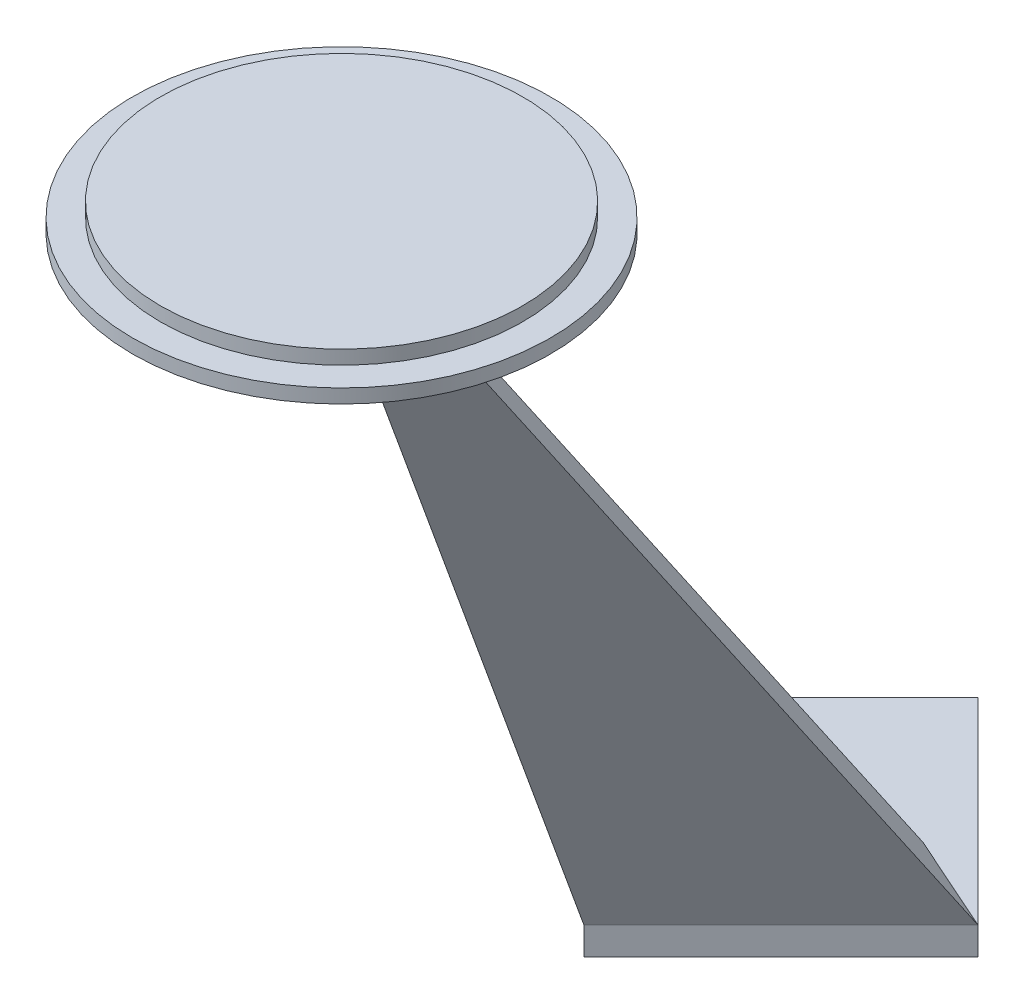
ISO-10303-21;
HEADER;
FILE_DESCRIPTION(('STEP AP214'),'2;1');
FILE_NAME('part.step','',(''),(''),'','','');
FILE_SCHEMA(('AUTOMOTIVE_DESIGN { 1 0 10303 214 1 1 1 1 }'));
ENDSEC;
DATA;
#1=APPLICATION_CONTEXT('core data for automotive mechanical design processes');
#2=APPLICATION_PROTOCOL_DEFINITION('international standard','automotive_design',2000,#1);
#3=PRODUCT_CONTEXT('',#1,'mechanical');
#4=PRODUCT('Part','Part','',(#3));
#5=PRODUCT_RELATED_PRODUCT_CATEGORY('part','',(#4));
#6=PRODUCT_DEFINITION_FORMATION('','',#4);
#7=PRODUCT_DEFINITION_CONTEXT('part definition',#1,'design');
#8=PRODUCT_DEFINITION('design','',#6,#7);
#9=PRODUCT_DEFINITION_SHAPE('','',#8);
#10=(LENGTH_UNIT() NAMED_UNIT(*) SI_UNIT(.MILLI.,.METRE.));
#11=(NAMED_UNIT(*) PLANE_ANGLE_UNIT() SI_UNIT($,.RADIAN.));
#12=(NAMED_UNIT(*) SI_UNIT($,.STERADIAN.) SOLID_ANGLE_UNIT());
#13=UNCERTAINTY_MEASURE_WITH_UNIT(LENGTH_MEASURE(1.E-05),#10,'distance_accuracy_value','');
#14=(GEOMETRIC_REPRESENTATION_CONTEXT(3) GLOBAL_UNCERTAINTY_ASSIGNED_CONTEXT((#13)) GLOBAL_UNIT_ASSIGNED_CONTEXT((#10,
#11,#12)) REPRESENTATION_CONTEXT('',''));
#15=CARTESIAN_POINT('',(0.,0.,0.));
#16=DIRECTION('',(0.,0.,1.));
#17=DIRECTION('',(1.,0.,0.));
#18=AXIS2_PLACEMENT_3D('',#15,#16,#17);
#19=CARTESIAN_POINT('',(0.,55.683094143225,31.5390299442695));
#20=DIRECTION('',(0.,-1.,0.));
#21=DIRECTION('',(0.,0.,-1.));
#22=AXIS2_PLACEMENT_3D('',#19,#20,#21);
#23=CYLINDRICAL_SURFACE('',#22,15.);
#24=CARTESIAN_POINT('',(0.,53.683094143225,31.5390299442695));
#25=DIRECTION('',(0.,1.,0.));
#26=DIRECTION('',(0.,0.,1.));
#27=AXIS2_PLACEMENT_3D('',#24,#25,#26);
#28=CIRCLE('',#27,15.);
#29=CARTESIAN_POINT('',(0.,53.683094143225,46.5390299442695));
#30=VERTEX_POINT('',#29);
#31=EDGE_CURVE('E207',#30,#30,#28,.T.);
#32=ORIENTED_EDGE('',*,*,#31,.T.);
#33=EDGE_LOOP('',(#32));
#34=FACE_BOUND('',#33,.T.);
#35=CARTESIAN_POINT('',(0.,54.683094143225,31.5390299442695));
#36=DIRECTION('',(0.,1.,0.));
#37=DIRECTION('',(0.,0.,1.));
#38=AXIS2_PLACEMENT_3D('',#35,#36,#37);
#39=CIRCLE('',#38,15.);
#40=CARTESIAN_POINT('',(0.,54.683094143225,46.5390299442695));
#41=VERTEX_POINT('',#40);
#42=EDGE_CURVE('E210',#41,#41,#39,.T.);
#43=ORIENTED_EDGE('',*,*,#42,.F.);
#44=EDGE_LOOP('',(#43));
#45=FACE_BOUND('',#44,.T.);
#46=ADVANCED_FACE('F34',(#34,#45),#23,.T.);
#47=CARTESIAN_POINT('',(0.,2.,0.));
#48=DIRECTION('',(0.,1.,0.));
#49=DIRECTION('',(0.,0.,1.));
#50=AXIS2_PLACEMENT_3D('',#47,#48,#49);
#51=PLANE('',#50);
#52=DIRECTION('',(-1.,0.,0.));
#53=VECTOR('',#52,1.);
#54=CARTESIAN_POINT('',(-14.1421356237312,2.,0.));
#55=LINE('',#54,#53);
#56=CARTESIAN_POINT('',(-12.,2.,1.25693328198353E-13));
#57=VERTEX_POINT('',#56);
#58=CARTESIAN_POINT('',(-14.142135623731,1.99999999999997,1.43982048506075E-13));
#59=VERTEX_POINT('',#58);
#60=EDGE_CURVE('E143',#57,#59,#55,.T.);
#61=ORIENTED_EDGE('',*,*,#60,.F.);
#62=DIRECTION('',(-0.707106781186551,0.,-0.707106781186544));
#63=VECTOR('',#62,1.);
#64=CARTESIAN_POINT('',(-12.,2.,1.25693328198353E-13));
#65=LINE('',#64,#63);
#66=CARTESIAN_POINT('',(0.,2.,12.));
#67=VERTEX_POINT('',#66);
#68=EDGE_CURVE('E141',#67,#57,#65,.T.);
#69=ORIENTED_EDGE('',*,*,#68,.F.);
#70=DIRECTION('',(-0.707106781186551,0.,0.707106781186544));
#71=VECTOR('',#70,1.);
#72=CARTESIAN_POINT('',(0.,2.,12.));
#73=LINE('',#72,#71);
#74=CARTESIAN_POINT('',(12.,2.,1.22165981013781E-13));
#75=VERTEX_POINT('',#74);
#76=EDGE_CURVE('E137',#75,#67,#73,.T.);
#77=ORIENTED_EDGE('',*,*,#76,.F.);
#78=DIRECTION('',(-1.,0.,0.));
#79=VECTOR('',#78,1.);
#80=CARTESIAN_POINT('',(12.,2.,1.22165981013781E-13));
#81=LINE('',#80,#79);
#82=CARTESIAN_POINT('',(14.1421356237312,1.99999999999997,2.1163626406917E-13));
#83=VERTEX_POINT('',#82);
#84=EDGE_CURVE('E134',#83,#75,#81,.T.);
#85=ORIENTED_EDGE('',*,*,#84,.F.);
#86=DIRECTION('',(-0.707106781186548,0.,-0.707106781186547));
#87=VECTOR('',#86,1.);
#88=CARTESIAN_POINT('',(14.1421356237311,2.,1.43114686768087E-13));
#89=LINE('',#88,#87);
#90=CARTESIAN_POINT('',(0.,2.,-14.1421356237309));
#91=VERTEX_POINT('',#90);
#92=EDGE_CURVE('E160',#83,#91,#89,.T.);
#93=ORIENTED_EDGE('',*,*,#92,.T.);
#94=DIRECTION('',(-0.707106781186546,0.,0.707106781186549));
#95=VECTOR('',#94,1.);
#96=CARTESIAN_POINT('',(0.,2.,-14.1421356237309));
#97=LINE('',#96,#95);
#98=EDGE_CURVE('E163',#91,#59,#97,.T.);
#99=ORIENTED_EDGE('',*,*,#98,.T.);
#100=EDGE_LOOP('',(#61,#69,#77,#85,#93,#99));
#101=FACE_BOUND('',#100,.T.);
#102=CARTESIAN_POINT('',(0.,2.,0.));
#103=DIRECTION('',(0.,1.,0.));
#104=DIRECTION('',(0.,0.,1.));
#105=AXIS2_PLACEMENT_3D('',#102,#103,#104);
#106=CIRCLE('',#105,1.5);
#107=CARTESIAN_POINT('',(0.,2.,1.5));
#108=VERTEX_POINT('',#107);
#109=EDGE_CURVE('E154',#108,#108,#106,.T.);
#110=ORIENTED_EDGE('',*,*,#109,.F.);
#111=EDGE_LOOP('',(#110));
#112=FACE_BOUND('',#111,.T.);
#113=ADVANCED_FACE('F230',(#101,#112),#51,.T.);
#114=CARTESIAN_POINT('',(0.,0.,0.));
#115=DIRECTION('',(0.,1.,0.));
#116=DIRECTION('',(0.,0.,1.));
#117=AXIS2_PLACEMENT_3D('',#114,#115,#116);
#118=PLANE('',#117);
#119=DIRECTION('',(-0.707106781186548,0.,-0.707106781186547));
#120=VECTOR('',#119,1.);
#121=CARTESIAN_POINT('',(14.1421356237311,0.,1.43114686768087E-13));
#122=LINE('',#121,#120);
#123=CARTESIAN_POINT('',(14.1421356237311,0.,1.43114686768087E-13));
#124=VERTEX_POINT('',#123);
#125=CARTESIAN_POINT('',(0.,0.,-14.1421356237309));
#126=VERTEX_POINT('',#125);
#127=EDGE_CURVE('E157',#124,#126,#122,.T.);
#128=ORIENTED_EDGE('',*,*,#127,.F.);
#129=DIRECTION('',(0.707106781186553,0.,-0.707106781186542));
#130=VECTOR('',#129,1.);
#131=CARTESIAN_POINT('',(0.,0.,14.1421356237309));
#132=LINE('',#131,#130);
#133=CARTESIAN_POINT('',(0.,0.,14.1421356237309));
#134=VERTEX_POINT('',#133);
#135=EDGE_CURVE('E164',#134,#124,#132,.T.);
#136=ORIENTED_EDGE('',*,*,#135,.F.);
#137=DIRECTION('',(0.707106781186551,0.,0.707106781186544));
#138=VECTOR('',#137,1.);
#139=CARTESIAN_POINT('',(-14.1421356237309,0.,0.));
#140=LINE('',#139,#138);
#141=CARTESIAN_POINT('',(-14.1421356237309,0.,0.));
#142=VERTEX_POINT('',#141);
#143=EDGE_CURVE('E178',#142,#134,#140,.T.);
#144=ORIENTED_EDGE('',*,*,#143,.F.);
#145=DIRECTION('',(-0.707106781186546,0.,0.707106781186549));
#146=VECTOR('',#145,1.);
#147=CARTESIAN_POINT('',(0.,0.,-14.1421356237309));
#148=LINE('',#147,#146);
#149=EDGE_CURVE('E176',#126,#142,#148,.T.);
#150=ORIENTED_EDGE('',*,*,#149,.F.);
#151=EDGE_LOOP('',(#128,#136,#144,#150));
#152=FACE_BOUND('',#151,.T.);
#153=CARTESIAN_POINT('',(0.,0.,0.));
#154=DIRECTION('',(0.,1.,0.));
#155=DIRECTION('',(0.,0.,1.));
#156=AXIS2_PLACEMENT_3D('',#153,#154,#155);
#157=CIRCLE('',#156,1.5);
#158=CARTESIAN_POINT('',(0.,0.,1.5));
#159=VERTEX_POINT('',#158);
#160=EDGE_CURVE('E153',#159,#159,#157,.T.);
#161=ORIENTED_EDGE('',*,*,#160,.T.);
#162=EDGE_LOOP('',(#161));
#163=FACE_BOUND('',#162,.T.);
#164=ADVANCED_FACE('F236',(#152,#163),#118,.F.);
#165=CARTESIAN_POINT('',(14.1421356237311,2.,1.43114686768087E-13));
#166=DIRECTION('',(-0.707106781186547,0.,0.707106781186548));
#167=DIRECTION('',(0.707106781186548,0.,0.707106781186547));
#168=AXIS2_PLACEMENT_3D('',#165,#166,#167);
#169=PLANE('',#168);
#170=ORIENTED_EDGE('',*,*,#127,.T.);
#171=DIRECTION('',(0.,-1.,0.));
#172=VECTOR('',#171,1.);
#173=CARTESIAN_POINT('',(0.,2.,-14.1421356237309));
#174=LINE('',#173,#172);
#175=EDGE_CURVE('E189',#91,#126,#174,.T.);
#176=ORIENTED_EDGE('',*,*,#175,.F.);
#177=ORIENTED_EDGE('',*,*,#92,.F.);
#178=DIRECTION('',(0.,-1.,0.));
#179=VECTOR('',#178,1.);
#180=CARTESIAN_POINT('',(14.1421356237311,2.,1.43114686768087E-13));
#181=LINE('',#180,#179);
#182=EDGE_CURVE('E173',#83,#124,#181,.T.);
#183=ORIENTED_EDGE('',*,*,#182,.T.);
#184=EDGE_LOOP('',(#170,#176,#177,#183));
#185=FACE_BOUND('',#184,.T.);
#186=ADVANCED_FACE('F36',(#185),#169,.F.);
#187=CARTESIAN_POINT('',(0.,2.,-14.1421356237309));
#188=DIRECTION('',(0.707106781186549,0.,0.707106781186546));
#189=DIRECTION('',(0.707106781186546,0.,-0.707106781186549));
#190=AXIS2_PLACEMENT_3D('',#187,#188,#189);
#191=PLANE('',#190);
#192=ORIENTED_EDGE('',*,*,#149,.T.);
#193=DIRECTION('',(0.,-1.,0.));
#194=VECTOR('',#193,1.);
#195=CARTESIAN_POINT('',(-14.1421356237309,2.,0.));
#196=LINE('',#195,#194);
#197=EDGE_CURVE('E186',#59,#142,#196,.T.);
#198=ORIENTED_EDGE('',*,*,#197,.F.);
#199=ORIENTED_EDGE('',*,*,#98,.F.);
#200=ORIENTED_EDGE('',*,*,#175,.T.);
#201=EDGE_LOOP('',(#192,#198,#199,#200));
#202=FACE_BOUND('',#201,.T.);
#203=ADVANCED_FACE('F279',(#202),#191,.F.);
#204=CARTESIAN_POINT('',(-14.1421356237309,2.,0.));
#205=DIRECTION('',(0.707106781186544,0.,-0.707106781186551));
#206=DIRECTION('',(-0.707106781186551,0.,-0.707106781186544));
#207=AXIS2_PLACEMENT_3D('',#204,#205,#206);
#208=PLANE('',#207);
#209=ORIENTED_EDGE('',*,*,#143,.T.);
#210=DIRECTION('',(0.,-1.,0.));
#211=VECTOR('',#210,1.);
#212=CARTESIAN_POINT('',(0.,2.,14.1421356237309));
#213=LINE('',#212,#211);
#214=CARTESIAN_POINT('',(0.,2.,14.1421356237309));
#215=VERTEX_POINT('',#214);
#216=EDGE_CURVE('E183',#215,#134,#213,.T.);
#217=ORIENTED_EDGE('',*,*,#216,.F.);
#218=DIRECTION('',(0.707106781186551,0.,0.707106781186544));
#219=VECTOR('',#218,1.);
#220=CARTESIAN_POINT('',(-14.1421356237309,2.,0.));
#221=LINE('',#220,#219);
#222=EDGE_CURVE('E167',#59,#215,#221,.T.);
#223=ORIENTED_EDGE('',*,*,#222,.F.);
#224=ORIENTED_EDGE('',*,*,#197,.T.);
#225=EDGE_LOOP('',(#209,#217,#223,#224));
#226=FACE_BOUND('',#225,.T.);
#227=ADVANCED_FACE('F276',(#226),#208,.F.);
#228=CARTESIAN_POINT('',(0.,2.,14.1421356237309));
#229=DIRECTION('',(-0.707106781186542,0.,-0.707106781186553));
#230=DIRECTION('',(-0.707106781186553,0.,0.707106781186542));
#231=AXIS2_PLACEMENT_3D('',#228,#229,#230);
#232=PLANE('',#231);
#233=ORIENTED_EDGE('',*,*,#135,.T.);
#234=ORIENTED_EDGE('',*,*,#182,.F.);
#235=DIRECTION('',(0.707106781186553,0.,-0.707106781186542));
#236=VECTOR('',#235,1.);
#237=CARTESIAN_POINT('',(0.,2.,14.1421356237309));
#238=LINE('',#237,#236);
#239=EDGE_CURVE('E170',#215,#83,#238,.T.);
#240=ORIENTED_EDGE('',*,*,#239,.F.);
#241=ORIENTED_EDGE('',*,*,#216,.T.);
#242=EDGE_LOOP('',(#233,#234,#240,#241));
#243=FACE_BOUND('',#242,.T.);
#244=ADVANCED_FACE('F268',(#243),#232,.F.);
#245=CARTESIAN_POINT('',(0.,2.,0.));
#246=DIRECTION('',(0.,-1.,0.));
#247=DIRECTION('',(0.,0.,-1.));
#248=AXIS2_PLACEMENT_3D('',#245,#246,#247);
#249=CYLINDRICAL_SURFACE('',#248,1.5);
#250=ORIENTED_EDGE('',*,*,#109,.T.);
#251=EDGE_LOOP('',(#250));
#252=FACE_BOUND('',#251,.T.);
#253=ORIENTED_EDGE('',*,*,#160,.F.);
#254=EDGE_LOOP('',(#253));
#255=FACE_BOUND('',#254,.T.);
#256=ADVANCED_FACE('F265',(#252,#255),#249,.F.);
#257=CARTESIAN_POINT('',(-14.1421356237312,53.683094143225,18.8111078829116));
#258=DIRECTION('',(0.684791078771742,0.24924356936395,-0.684791078771732));
#259=DIRECTION('',(-0.707106781186542,0.,-0.707106781186553));
#260=AXIS2_PLACEMENT_3D('',#257,#258,#259);
#261=PLANE('',#260);
#262=DIRECTION('',(0.707106781186542,0.,0.707106781186553));
#263=VECTOR('',#262,1.);
#264=CARTESIAN_POINT('',(-14.1421356237312,53.683094143225,18.8111078829116));
#265=LINE('',#264,#263);
#266=CARTESIAN_POINT('',(-1.41421356237341,53.683094143225,31.5390299442696));
#267=VERTEX_POINT('',#266);
#268=CARTESIAN_POINT('',(0.,53.683094143225,32.953243506643));
#269=VERTEX_POINT('',#268);
#270=EDGE_CURVE('E145',#267,#269,#265,.T.);
#271=ORIENTED_EDGE('',*,*,#270,.F.);
#272=DIRECTION('',(0.205721604359995,0.835354663092496,0.509765836781136));
#273=VECTOR('',#272,1.);
#274=CARTESIAN_POINT('',(-14.142135623731,1.99999999999997,1.43982048506075E-13));
#275=LINE('',#274,#273);
#276=EDGE_CURVE('E48',#59,#267,#275,.T.);
#277=ORIENTED_EDGE('',*,*,#276,.F.);
#278=ORIENTED_EDGE('',*,*,#222,.T.);
#279=DIRECTION('',(0.,-0.939692620785909,-0.342020143325666));
#280=VECTOR('',#279,1.);
#281=CARTESIAN_POINT('',(0.,53.683094143225,32.953243506643));
#282=LINE('',#281,#280);
#283=EDGE_CURVE('E150',#269,#215,#282,.T.);
#284=ORIENTED_EDGE('',*,*,#283,.F.);
#285=EDGE_LOOP('',(#271,#277,#278,#284));
#286=FACE_BOUND('',#285,.T.);
#287=ADVANCED_FACE('F262',(#286),#261,.F.);
#288=CARTESIAN_POINT('',(0.,53.683094143225,32.953243506643));
#289=DIRECTION('',(-0.684791078771736,0.249243569363952,-0.684791078771736));
#290=DIRECTION('',(-0.707106781186547,0.,0.707106781186547));
#291=AXIS2_PLACEMENT_3D('',#288,#289,#290);
#292=PLANE('',#291);
#293=ORIENTED_EDGE('',*,*,#239,.T.);
#294=DIRECTION('',(0.205721604359996,-0.835354663092497,-0.509765836781134));
#295=VECTOR('',#294,1.);
#296=CARTESIAN_POINT('',(14.1421356237312,1.99999999999997,2.1163626406917E-13));
#297=LINE('',#296,#295);
#298=CARTESIAN_POINT('',(1.41421356237353,53.683094143225,31.5390299442695));
#299=VERTEX_POINT('',#298);
#300=EDGE_CURVE('E193',#299,#83,#297,.T.);
#301=ORIENTED_EDGE('',*,*,#300,.F.);
#302=DIRECTION('',(0.707106781186548,0.,-0.707106781186547));
#303=VECTOR('',#302,1.);
#304=CARTESIAN_POINT('',(0.,53.683094143225,32.953243506643));
#305=LINE('',#304,#303);
#306=EDGE_CURVE('E130',#269,#299,#305,.T.);
#307=ORIENTED_EDGE('',*,*,#306,.F.);
#308=ORIENTED_EDGE('',*,*,#283,.T.);
#309=EDGE_LOOP('',(#293,#301,#307,#308));
#310=FACE_BOUND('',#309,.T.);
#311=ADVANCED_FACE('F197',(#310),#292,.F.);
#312=CARTESIAN_POINT('',(12.,53.683094143225,18.8111078829118));
#313=DIRECTION('',(0.,-0.342020143325666,0.939692620785909));
#314=DIRECTION('',(0.,-0.939692620785909,-0.342020143325666));
#315=AXIS2_PLACEMENT_3D('',#312,#313,#314);
#316=PLANE('',#315);
#317=DIRECTION('',(0.,-0.939692620785909,-0.342020143325666));
#318=VECTOR('',#317,1.);
#319=CARTESIAN_POINT('',(12.,53.683094143225,18.8111078829118));
#320=LINE('',#319,#318);
#321=CARTESIAN_POINT('',(12.,6.9849867490131,1.81438679485232));
#322=VERTEX_POINT('',#321);
#323=EDGE_CURVE('E148',#322,#75,#320,.T.);
#324=ORIENTED_EDGE('',*,*,#323,.F.);
#325=DIRECTION('',(0.374428075354097,-0.871335583714215,-0.31714021652896));
#326=VECTOR('',#325,1.);
#327=CARTESIAN_POINT('',(-5.2536706008633,47.1361883649673,16.4282290530815));
#328=LINE('',#327,#326);
#329=EDGE_CURVE('E138',#322,#83,#328,.T.);
#330=ORIENTED_EDGE('',*,*,#329,.T.);
#331=ORIENTED_EDGE('',*,*,#84,.T.);
#332=EDGE_LOOP('',(#324,#330,#331));
#333=FACE_BOUND('',#332,.T.);
#334=ADVANCED_FACE('F255',(#333),#316,.F.);
#335=CARTESIAN_POINT('',(0.,53.683094143225,30.8111078829116));
#336=DIRECTION('',(0.684791078771733,-0.249243569363953,0.68479107877174));
#337=DIRECTION('',(0.707106781186551,0.,-0.707106781186544));
#338=AXIS2_PLACEMENT_3D('',#335,#336,#337);
#339=PLANE('',#338);
#340=DIRECTION('',(-0.707106781186551,0.,0.707106781186544));
#341=VECTOR('',#340,1.);
#342=CARTESIAN_POINT('',(0.,53.683094143225,30.8111078829116));
#343=LINE('',#342,#341);
#344=CARTESIAN_POINT('',(0.499723532818817,53.683094143225,30.3113843500928));
#345=VERTEX_POINT('',#344);
#346=CARTESIAN_POINT('',(0.,53.683094143225,30.8111078829116));
#347=VERTEX_POINT('',#346);
#348=EDGE_CURVE('E126',#345,#347,#343,.T.);
#349=ORIENTED_EDGE('',*,*,#348,.F.);
#350=DIRECTION('',(0.205721604359997,-0.835354663092498,-0.509765836781133));
#351=VECTOR('',#350,1.);
#352=CARTESIAN_POINT('',(0.426168614216202,53.9817717878955,30.4936490409962));
#353=LINE('',#352,#351);
#354=EDGE_CURVE('E56',#345,#322,#353,.T.);
#355=ORIENTED_EDGE('',*,*,#354,.T.);
#356=ORIENTED_EDGE('',*,*,#323,.T.);
#357=ORIENTED_EDGE('',*,*,#76,.T.);
#358=DIRECTION('',(0.,-0.939692620785909,-0.342020143325666));
#359=VECTOR('',#358,1.);
#360=CARTESIAN_POINT('',(0.,53.683094143225,30.8111078829116));
#361=LINE('',#360,#359);
#362=EDGE_CURVE('E128',#347,#67,#361,.T.);
#363=ORIENTED_EDGE('',*,*,#362,.F.);
#364=EDGE_LOOP('',(#349,#355,#356,#357,#363));
#365=FACE_BOUND('',#364,.T.);
#366=ADVANCED_FACE('F252',(#365),#339,.F.);
#367=CARTESIAN_POINT('',(-12.,53.683094143225,18.8111078829118));
#368=DIRECTION('',(-0.684791078771733,-0.249243569363953,0.68479107877174));
#369=DIRECTION('',(0.707106781186551,0.,0.707106781186544));
#370=AXIS2_PLACEMENT_3D('',#367,#368,#369);
#371=PLANE('',#370);
#372=DIRECTION('',(0.,-0.939692620785909,-0.342020143325666));
#373=VECTOR('',#372,1.);
#374=CARTESIAN_POINT('',(-12.,53.683094143225,18.8111078829118));
#375=LINE('',#374,#373);
#376=CARTESIAN_POINT('',(-12.,6.98498674901284,1.81438679485223));
#377=VERTEX_POINT('',#376);
#378=EDGE_CURVE('E115',#377,#57,#375,.T.);
#379=ORIENTED_EDGE('',*,*,#378,.F.);
#380=DIRECTION('',(0.205721604359997,0.835354663092497,0.509765836781134));
#381=VECTOR('',#380,1.);
#382=CARTESIAN_POINT('',(-2.1924633057079,46.8095425437992,26.1168763913199));
#383=LINE('',#382,#381);
#384=CARTESIAN_POINT('',(-0.499723532818719,53.683094143225,30.3113843500929));
#385=VERTEX_POINT('',#384);
#386=EDGE_CURVE('E108',#377,#385,#383,.T.);
#387=ORIENTED_EDGE('',*,*,#386,.T.);
#388=DIRECTION('',(-0.707106781186551,0.,-0.707106781186544));
#389=VECTOR('',#388,1.);
#390=CARTESIAN_POINT('',(-12.,53.683094143225,18.8111078829118));
#391=LINE('',#390,#389);
#392=EDGE_CURVE('E112',#347,#385,#391,.T.);
#393=ORIENTED_EDGE('',*,*,#392,.F.);
#394=ORIENTED_EDGE('',*,*,#362,.T.);
#395=ORIENTED_EDGE('',*,*,#68,.T.);
#396=EDGE_LOOP('',(#379,#387,#393,#394,#395));
#397=FACE_BOUND('',#396,.T.);
#398=ADVANCED_FACE('F109',(#397),#371,.F.);
#399=CARTESIAN_POINT('',(-14.1421356237312,53.683094143225,18.8111078829116));
#400=DIRECTION('',(0.,-0.342020143325666,0.939692620785909));
#401=DIRECTION('',(0.,-0.939692620785909,-0.342020143325666));
#402=AXIS2_PLACEMENT_3D('',#399,#400,#401);
#403=PLANE('',#402);
#404=ORIENTED_EDGE('',*,*,#60,.T.);
#405=DIRECTION('',(0.374428075354099,0.871335583714214,0.31714021652896));
#406=VECTOR('',#405,1.);
#407=CARTESIAN_POINT('',(4.95335093320699,46.4373112503948,16.1738585859674));
#408=LINE('',#407,#406);
#409=EDGE_CURVE('E117',#59,#377,#408,.T.);
#410=ORIENTED_EDGE('',*,*,#409,.T.);
#411=ORIENTED_EDGE('',*,*,#378,.T.);
#412=EDGE_LOOP('',(#404,#410,#411));
#413=FACE_BOUND('',#412,.T.);
#414=ADVANCED_FACE('F246',(#413),#403,.F.);
#415=CARTESIAN_POINT('',(12.7725534661877,2.49848713872788,-1.36958215754326));
#416=DIRECTION('',(-0.699099277595243,-0.489959416666664,0.520768633930147));
#417=DIRECTION('',(0.597386263541247,0.,0.801953647121969));
#418=AXIS2_PLACEMENT_3D('',#415,#416,#417);
#419=PLANE('',#418);
#420=ORIENTED_EDGE('',*,*,#354,.F.);
#421=DIRECTION('',(0.597386263541247,0.,0.801953647121969));
#422=VECTOR('',#421,1.);
#423=CARTESIAN_POINT('',(-5.18812049404878,53.683094143225,22.6758099487534));
#424=LINE('',#423,#422);
#425=EDGE_CURVE('E42',#345,#299,#424,.T.);
#426=ORIENTED_EDGE('',*,*,#425,.T.);
#427=ORIENTED_EDGE('',*,*,#300,.T.);
#428=ORIENTED_EDGE('',*,*,#329,.F.);
#429=EDGE_LOOP('',(#420,#426,#427,#428));
#430=FACE_BOUND('',#429,.T.);
#431=ADVANCED_FACE('F192',(#430),#419,.F.);
#432=CARTESIAN_POINT('',(-12.7725534661875,2.49848713872787,-1.36958215754332));
#433=DIRECTION('',(0.699099277595238,-0.489959416666666,0.520768633930152));
#434=DIRECTION('',(0.597386263541253,0.,-0.801953647121964));
#435=AXIS2_PLACEMENT_3D('',#432,#433,#434);
#436=PLANE('',#435);
#437=ORIENTED_EDGE('',*,*,#276,.T.);
#438=DIRECTION('',(0.597386263541253,0.,-0.801953647121964));
#439=VECTOR('',#438,1.);
#440=CARTESIAN_POINT('',(5.18812049404892,53.683094143225,22.6758099487535));
#441=LINE('',#440,#439);
#442=EDGE_CURVE('E11',#267,#385,#441,.T.);
#443=ORIENTED_EDGE('',*,*,#442,.T.);
#444=ORIENTED_EDGE('',*,*,#386,.F.);
#445=ORIENTED_EDGE('',*,*,#409,.F.);
#446=EDGE_LOOP('',(#437,#443,#444,#445));
#447=FACE_BOUND('',#446,.T.);
#448=ADVANCED_FACE('F120',(#447),#436,.F.);
#449=CARTESIAN_POINT('',(0.,53.683094143225,31.5390299442695));
#450=DIRECTION('',(0.,1.,0.));
#451=DIRECTION('',(0.,0.,1.));
#452=AXIS2_PLACEMENT_3D('',#449,#450,#451);
#453=PLANE('',#452);
#454=ORIENTED_EDGE('',*,*,#442,.F.);
#455=ORIENTED_EDGE('',*,*,#270,.T.);
#456=ORIENTED_EDGE('',*,*,#306,.T.);
#457=ORIENTED_EDGE('',*,*,#425,.F.);
#458=ORIENTED_EDGE('',*,*,#348,.T.);
#459=ORIENTED_EDGE('',*,*,#392,.T.);
#460=EDGE_LOOP('',(#454,#455,#456,#457,#458,#459));
#461=FACE_BOUND('',#460,.T.);
#462=ORIENTED_EDGE('',*,*,#31,.F.);
#463=EDGE_LOOP('',(#462));
#464=FACE_BOUND('',#463,.T.);
#465=ADVANCED_FACE('F123',(#461,#464),#453,.F.);
#466=CARTESIAN_POINT('',(0.,54.683094143225,31.5390299442695));
#467=DIRECTION('',(0.,1.,0.));
#468=DIRECTION('',(0.,0.,1.));
#469=AXIS2_PLACEMENT_3D('',#466,#467,#468);
#470=PLANE('',#469);
#471=CARTESIAN_POINT('',(0.,54.683094143225,31.5390299442695));
#472=DIRECTION('',(0.,1.,0.));
#473=DIRECTION('',(0.,0.,1.));
#474=AXIS2_PLACEMENT_3D('',#471,#472,#473);
#475=CIRCLE('',#474,13.);
#476=CARTESIAN_POINT('',(0.,54.683094143225,44.5390299442695));
#477=VERTEX_POINT('',#476);
#478=EDGE_CURVE('E213',#477,#477,#475,.T.);
#479=ORIENTED_EDGE('',*,*,#478,.F.);
#480=EDGE_LOOP('',(#479));
#481=FACE_BOUND('',#480,.T.);
#482=ORIENTED_EDGE('',*,*,#42,.T.);
#483=EDGE_LOOP('',(#482));
#484=FACE_BOUND('',#483,.T.);
#485=ADVANCED_FACE('F223',(#481,#484),#470,.T.);
#486=CARTESIAN_POINT('',(0.,54.683094143225,31.5390299442695));
#487=DIRECTION('',(0.,1.,0.));
#488=DIRECTION('',(0.,0.,1.));
#489=AXIS2_PLACEMENT_3D('',#486,#487,#488);
#490=CYLINDRICAL_SURFACE('',#489,13.);
#491=ORIENTED_EDGE('',*,*,#478,.T.);
#492=EDGE_LOOP('',(#491));
#493=FACE_BOUND('',#492,.T.);
#494=CARTESIAN_POINT('',(0.,55.683094143225,31.5390299442695));
#495=DIRECTION('',(0.,1.,0.));
#496=DIRECTION('',(0.,0.,1.));
#497=AXIS2_PLACEMENT_3D('',#494,#495,#496);
#498=CIRCLE('',#497,13.);
#499=CARTESIAN_POINT('',(0.,55.683094143225,44.5390299442695));
#500=VERTEX_POINT('',#499);
#501=EDGE_CURVE('E214',#500,#500,#498,.T.);
#502=ORIENTED_EDGE('',*,*,#501,.F.);
#503=EDGE_LOOP('',(#502));
#504=FACE_BOUND('',#503,.T.);
#505=ADVANCED_FACE('F220',(#493,#504),#490,.T.);
#506=CARTESIAN_POINT('',(0.,55.683094143225,31.5390299442695));
#507=DIRECTION('',(0.,1.,0.));
#508=DIRECTION('',(0.,0.,1.));
#509=AXIS2_PLACEMENT_3D('',#506,#507,#508);
#510=PLANE('',#509);
#511=ORIENTED_EDGE('',*,*,#501,.T.);
#512=EDGE_LOOP('',(#511));
#513=FACE_BOUND('',#512,.T.);
#514=ADVANCED_FACE('F400',(#513),#510,.T.);
#515=CLOSED_SHELL('',(#46,#113,#164,#186,#203,#227,#244,#256,#287,#311,#334,#366,#398,#414,#431,
#448,#465,#485,#505,#514));
#516=MANIFOLD_SOLID_BREP('B2',#515);
#517=ADVANCED_BREP_SHAPE_REPRESENTATION('',(#18,#516),#14);
#518=SHAPE_DEFINITION_REPRESENTATION(#9,#517);
ENDSEC;
END-ISO-10303-21;
